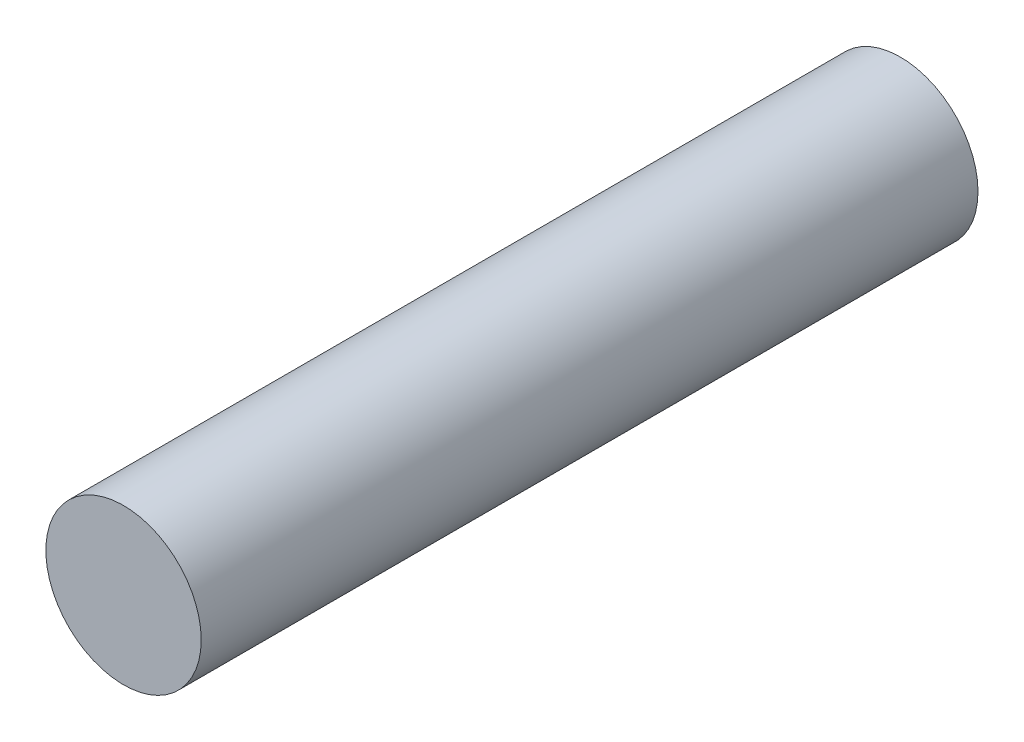
ISO-10303-21;
HEADER;
FILE_DESCRIPTION(('STEP AP214'),'2;1');
FILE_NAME('part.step','',(''),(''),'','','');
FILE_SCHEMA(('AUTOMOTIVE_DESIGN { 1 0 10303 214 1 1 1 1 }'));
ENDSEC;
DATA;
#1=APPLICATION_CONTEXT('core data for automotive mechanical design processes');
#2=APPLICATION_PROTOCOL_DEFINITION('international standard','automotive_design',2000,#1);
#3=PRODUCT_CONTEXT('',#1,'mechanical');
#4=PRODUCT('Part','Part','',(#3));
#5=PRODUCT_RELATED_PRODUCT_CATEGORY('part','',(#4));
#6=PRODUCT_DEFINITION_FORMATION('','',#4);
#7=PRODUCT_DEFINITION_CONTEXT('part definition',#1,'design');
#8=PRODUCT_DEFINITION('design','',#6,#7);
#9=PRODUCT_DEFINITION_SHAPE('','',#8);
#10=(LENGTH_UNIT() NAMED_UNIT(*) SI_UNIT(.MILLI.,.METRE.));
#11=(NAMED_UNIT(*) PLANE_ANGLE_UNIT() SI_UNIT($,.RADIAN.));
#12=(NAMED_UNIT(*) SI_UNIT($,.STERADIAN.) SOLID_ANGLE_UNIT());
#13=UNCERTAINTY_MEASURE_WITH_UNIT(LENGTH_MEASURE(1.E-05),#10,'distance_accuracy_value','');
#14=(GEOMETRIC_REPRESENTATION_CONTEXT(3) GLOBAL_UNCERTAINTY_ASSIGNED_CONTEXT((#13)) GLOBAL_UNIT_ASSIGNED_CONTEXT((#10,
#11,#12)) REPRESENTATION_CONTEXT('',''));
#15=CARTESIAN_POINT('',(0.,0.,0.));
#16=DIRECTION('',(0.,0.,1.));
#17=DIRECTION('',(1.,0.,0.));
#18=AXIS2_PLACEMENT_3D('',#15,#16,#17);
#19=CARTESIAN_POINT('',(0.,0.,10.));
#20=DIRECTION('',(0.,0.,-1.));
#21=DIRECTION('',(-1.,0.,0.));
#22=AXIS2_PLACEMENT_3D('',#19,#20,#21);
#23=CYLINDRICAL_SURFACE('',#22,1.);
#24=CARTESIAN_POINT('',(0.,0.,10.));
#25=DIRECTION('',(0.,0.,1.));
#26=DIRECTION('',(1.,0.,0.));
#27=AXIS2_PLACEMENT_3D('',#24,#25,#26);
#28=CIRCLE('',#27,1.);
#29=CARTESIAN_POINT('',(1.,0.,10.));
#30=VERTEX_POINT('',#29);
#31=EDGE_CURVE('E10',#30,#30,#28,.T.);
#32=ORIENTED_EDGE('',*,*,#31,.F.);
#33=EDGE_LOOP('',(#32));
#34=FACE_BOUND('',#33,.T.);
#35=CARTESIAN_POINT('',(0.,0.,0.));
#36=DIRECTION('',(0.,0.,1.));
#37=DIRECTION('',(1.,0.,0.));
#38=AXIS2_PLACEMENT_3D('',#35,#36,#37);
#39=CIRCLE('',#38,1.);
#40=CARTESIAN_POINT('',(1.,0.,0.));
#41=VERTEX_POINT('',#40);
#42=EDGE_CURVE('E42',#41,#41,#39,.T.);
#43=ORIENTED_EDGE('',*,*,#42,.T.);
#44=EDGE_LOOP('',(#43));
#45=FACE_BOUND('',#44,.T.);
#46=ADVANCED_FACE('F39',(#34,#45),#23,.T.);
#47=CARTESIAN_POINT('',(0.,0.,10.));
#48=DIRECTION('',(0.,0.,1.));
#49=DIRECTION('',(1.,0.,0.));
#50=AXIS2_PLACEMENT_3D('',#47,#48,#49);
#51=PLANE('',#50);
#52=ORIENTED_EDGE('',*,*,#31,.T.);
#53=EDGE_LOOP('',(#52));
#54=FACE_BOUND('',#53,.T.);
#55=ADVANCED_FACE('F54',(#54),#51,.T.);
#56=CARTESIAN_POINT('',(0.,0.,0.));
#57=DIRECTION('',(0.,0.,1.));
#58=DIRECTION('',(1.,0.,0.));
#59=AXIS2_PLACEMENT_3D('',#56,#57,#58);
#60=PLANE('',#59);
#61=ORIENTED_EDGE('',*,*,#42,.F.);
#62=EDGE_LOOP('',(#61));
#63=FACE_BOUND('',#62,.T.);
#64=ADVANCED_FACE('F52',(#63),#60,.F.);
#65=CLOSED_SHELL('',(#46,#55,#64));
#66=MANIFOLD_SOLID_BREP('B2',#65);
#67=ADVANCED_BREP_SHAPE_REPRESENTATION('',(#18,#66),#14);
#68=SHAPE_DEFINITION_REPRESENTATION(#9,#67);
ENDSEC;
END-ISO-10303-21;
